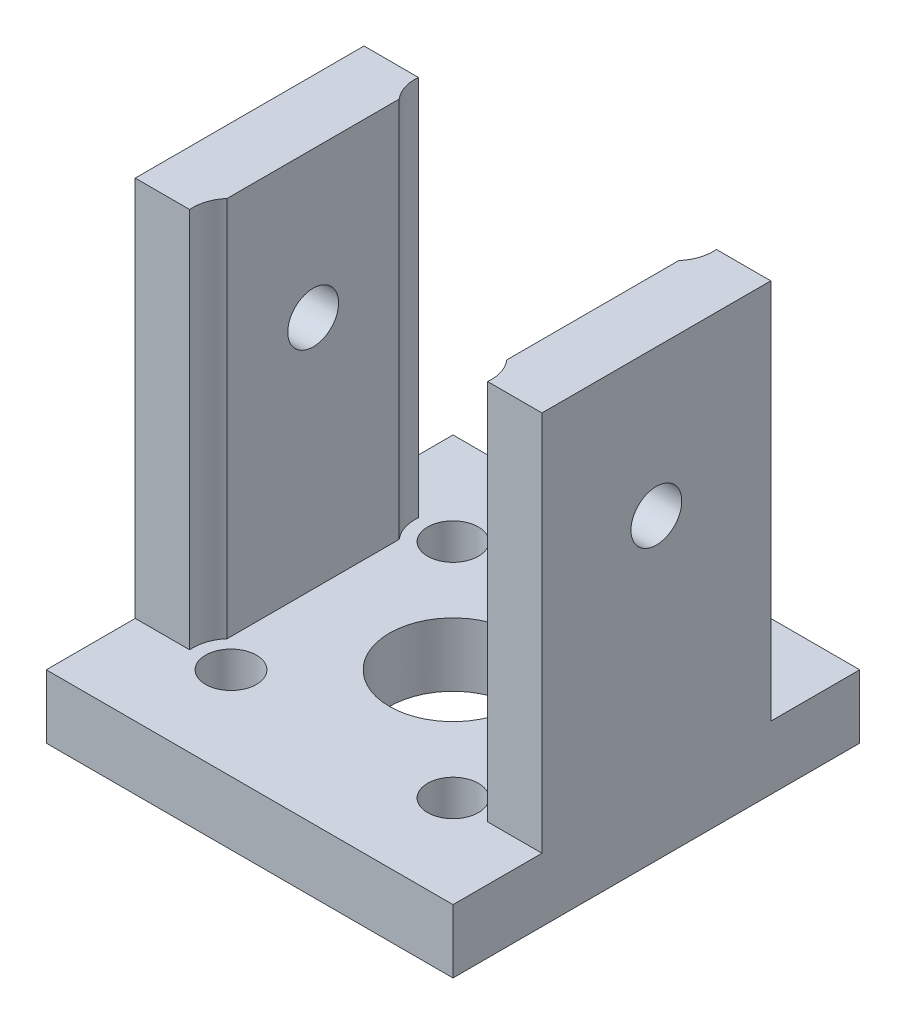
ISO-10303-21;
HEADER;
FILE_DESCRIPTION(('STEP AP214'),'2;1');
FILE_NAME('part.step','',(''),(''),'','','');
FILE_SCHEMA(('AUTOMOTIVE_DESIGN { 1 0 10303 214 1 1 1 1 }'));
ENDSEC;
DATA;
#1=APPLICATION_CONTEXT('core data for automotive mechanical design processes');
#2=APPLICATION_PROTOCOL_DEFINITION('international standard','automotive_design',2000,#1);
#3=PRODUCT_CONTEXT('',#1,'mechanical');
#4=PRODUCT('Part','Part','',(#3));
#5=PRODUCT_RELATED_PRODUCT_CATEGORY('part','',(#4));
#6=PRODUCT_DEFINITION_FORMATION('','',#4);
#7=PRODUCT_DEFINITION_CONTEXT('part definition',#1,'design');
#8=PRODUCT_DEFINITION('design','',#6,#7);
#9=PRODUCT_DEFINITION_SHAPE('','',#8);
#10=(LENGTH_UNIT() NAMED_UNIT(*) SI_UNIT(.MILLI.,.METRE.));
#11=(NAMED_UNIT(*) PLANE_ANGLE_UNIT() SI_UNIT($,.RADIAN.));
#12=(NAMED_UNIT(*) SI_UNIT($,.STERADIAN.) SOLID_ANGLE_UNIT());
#13=UNCERTAINTY_MEASURE_WITH_UNIT(LENGTH_MEASURE(1.E-05),#10,'distance_accuracy_value','');
#14=(GEOMETRIC_REPRESENTATION_CONTEXT(3) GLOBAL_UNCERTAINTY_ASSIGNED_CONTEXT((#13)) GLOBAL_UNIT_ASSIGNED_CONTEXT((#10,
#11,#12)) REPRESENTATION_CONTEXT('',''));
#15=CARTESIAN_POINT('',(0.,0.,0.));
#16=DIRECTION('',(0.,0.,1.));
#17=DIRECTION('',(1.,0.,0.));
#18=AXIS2_PLACEMENT_3D('',#15,#16,#17);
#19=CARTESIAN_POINT('',(0.,5.,0.));
#20=DIRECTION('',(0.,1.,0.));
#21=DIRECTION('',(0.,0.,1.));
#22=AXIS2_PLACEMENT_3D('',#19,#20,#21);
#23=PLANE('',#22);
#24=CARTESIAN_POINT('',(8.73276874765368,5.,7.26723125234616));
#25=DIRECTION('',(0.,1.,0.));
#26=DIRECTION('',(0.,0.,1.));
#27=AXIS2_PLACEMENT_3D('',#24,#25,#26);
#28=CIRCLE('',#27,2.00000000000035);
#29=CARTESIAN_POINT('',(8.73276874765368,5.,9.26723125234651));
#30=VERTEX_POINT('',#29);
#31=EDGE_CURVE('E564',#30,#30,#28,.T.);
#32=ORIENTED_EDGE('',*,*,#31,.F.);
#33=EDGE_LOOP('',(#32));
#34=FACE_BOUND('',#33,.T.);
#35=CARTESIAN_POINT('',(8.73276874765391,5.,24.7327687476539));
#36=DIRECTION('',(0.,1.,0.));
#37=DIRECTION('',(0.,0.,1.));
#38=AXIS2_PLACEMENT_3D('',#35,#36,#37);
#39=CIRCLE('',#38,2.);
#40=CARTESIAN_POINT('',(8.73276874765391,5.,26.7327687476539));
#41=VERTEX_POINT('',#40);
#42=EDGE_CURVE('E561',#41,#41,#39,.T.);
#43=ORIENTED_EDGE('',*,*,#42,.F.);
#44=EDGE_LOOP('',(#43));
#45=FACE_BOUND('',#44,.T.);
#46=CARTESIAN_POINT('',(-8.73276874765385,5.,24.7327687476538));
#47=DIRECTION('',(0.,1.,0.));
#48=DIRECTION('',(0.,0.,1.));
#49=AXIS2_PLACEMENT_3D('',#46,#47,#48);
#50=CIRCLE('',#49,2.);
#51=CARTESIAN_POINT('',(-8.73276874765385,5.,26.7327687476538));
#52=VERTEX_POINT('',#51);
#53=EDGE_CURVE('E558',#52,#52,#50,.T.);
#54=ORIENTED_EDGE('',*,*,#53,.F.);
#55=EDGE_LOOP('',(#54));
#56=FACE_BOUND('',#55,.T.);
#57=CARTESIAN_POINT('',(-8.73276874765404,5.,7.26723125234639));
#58=DIRECTION('',(0.,1.,0.));
#59=DIRECTION('',(0.,0.,1.));
#60=AXIS2_PLACEMENT_3D('',#57,#58,#59);
#61=CIRCLE('',#60,2.00000000000041);
#62=CARTESIAN_POINT('',(-8.73276874765404,5.,9.2672312523468));
#63=VERTEX_POINT('',#62);
#64=EDGE_CURVE('E555',#63,#63,#61,.T.);
#65=ORIENTED_EDGE('',*,*,#64,.F.);
#66=EDGE_LOOP('',(#65));
#67=FACE_BOUND('',#66,.T.);
#68=CARTESIAN_POINT('',(0.,5.,16.));
#69=DIRECTION('',(0.,1.,0.));
#70=DIRECTION('',(0.,0.,1.));
#71=AXIS2_PLACEMENT_3D('',#68,#69,#70);
#72=CIRCLE('',#71,5.);
#73=CARTESIAN_POINT('',(0.,5.,21.));
#74=VERTEX_POINT('',#73);
#75=EDGE_CURVE('E552',#74,#74,#72,.T.);
#76=ORIENTED_EDGE('',*,*,#75,.F.);
#77=EDGE_LOOP('',(#76));
#78=FACE_BOUND('',#77,.T.);
#79=DIRECTION('',(0.,0.,-1.));
#80=VECTOR('',#79,1.);
#81=CARTESIAN_POINT('',(16.,5.,0.));
#82=LINE('',#81,#80);
#83=CARTESIAN_POINT('',(16.,5.,32.));
#84=VERTEX_POINT('',#83);
#85=CARTESIAN_POINT('',(16.,5.,25.));
#86=VERTEX_POINT('',#85);
#87=EDGE_CURVE('E229',#84,#86,#82,.T.);
#88=ORIENTED_EDGE('',*,*,#87,.T.);
#89=DIRECTION('',(1.,0.,0.));
#90=VECTOR('',#89,1.);
#91=CARTESIAN_POINT('',(16.,5.,25.));
#92=LINE('',#91,#90);
#93=CARTESIAN_POINT('',(11.7257011928435,5.,25.));
#94=VERTEX_POINT('',#93);
#95=EDGE_CURVE('E579',#94,#86,#92,.T.);
#96=ORIENTED_EDGE('',*,*,#95,.F.);
#97=CARTESIAN_POINT('',(8.73723125234614,5.,24.7372312523464));
#98=DIRECTION('',(0.,-1.,0.));
#99=DIRECTION('',(0.,0.,1.));
#100=AXIS2_PLACEMENT_3D('',#97,#98,#99);
#101=CIRCLE('',#100,3.);
#102=CARTESIAN_POINT('',(11.,5.,22.7674907631852));
#103=VERTEX_POINT('',#102);
#104=EDGE_CURVE('E577',#103,#94,#101,.T.);
#105=ORIENTED_EDGE('',*,*,#104,.F.);
#106=DIRECTION('',(0.,0.,1.));
#107=VECTOR('',#106,1.);
#108=CARTESIAN_POINT('',(11.,5.,9.23697174150738));
#109=LINE('',#108,#107);
#110=CARTESIAN_POINT('',(11.,5.,9.23697174150738));
#111=VERTEX_POINT('',#110);
#112=EDGE_CURVE('E575',#111,#103,#109,.T.);
#113=ORIENTED_EDGE('',*,*,#112,.F.);
#114=CARTESIAN_POINT('',(8.73723125234596,5.,7.26723125234639));
#115=DIRECTION('',(0.,-1.,0.));
#116=DIRECTION('',(0.,0.,1.));
#117=AXIS2_PLACEMENT_3D('',#114,#115,#116);
#118=CIRCLE('',#117,3.);
#119=CARTESIAN_POINT('',(11.7253054578786,5.,7.));
#120=VERTEX_POINT('',#119);
#121=EDGE_CURVE('E172',#120,#111,#118,.T.);
#122=ORIENTED_EDGE('',*,*,#121,.F.);
#123=DIRECTION('',(-1.,0.,0.));
#124=VECTOR('',#123,1.);
#125=CARTESIAN_POINT('',(16.,5.,7.));
#126=LINE('',#125,#124);
#127=CARTESIAN_POINT('',(16.,5.,7.));
#128=VERTEX_POINT('',#127);
#129=EDGE_CURVE('E168',#128,#120,#126,.T.);
#130=ORIENTED_EDGE('',*,*,#129,.F.);
#131=CARTESIAN_POINT('',(16.,5.,0.));
#132=VERTEX_POINT('',#131);
#133=EDGE_CURVE('E228',#128,#132,#82,.T.);
#134=ORIENTED_EDGE('',*,*,#133,.T.);
#135=DIRECTION('',(-1.,0.,0.));
#136=VECTOR('',#135,1.);
#137=CARTESIAN_POINT('',(-16.,5.,0.));
#138=LINE('',#137,#136);
#139=CARTESIAN_POINT('',(-16.,5.,0.));
#140=VERTEX_POINT('',#139);
#141=EDGE_CURVE('E232',#132,#140,#138,.T.);
#142=ORIENTED_EDGE('',*,*,#141,.T.);
#143=DIRECTION('',(0.,0.,1.));
#144=VECTOR('',#143,1.);
#145=CARTESIAN_POINT('',(-16.,5.,0.));
#146=LINE('',#145,#144);
#147=CARTESIAN_POINT('',(-16.,5.,7.));
#148=VERTEX_POINT('',#147);
#149=EDGE_CURVE('E223',#140,#148,#146,.T.);
#150=ORIENTED_EDGE('',*,*,#149,.T.);
#151=DIRECTION('',(-1.,0.,0.));
#152=VECTOR('',#151,1.);
#153=CARTESIAN_POINT('',(-16.,5.,7.));
#154=LINE('',#153,#152);
#155=CARTESIAN_POINT('',(-11.7208429531867,5.,7.));
#156=VERTEX_POINT('',#155);
#157=EDGE_CURVE('E59',#156,#148,#154,.T.);
#158=ORIENTED_EDGE('',*,*,#157,.F.);
#159=CARTESIAN_POINT('',(-8.73276874765404,5.,7.26723125234639));
#160=DIRECTION('',(0.,-1.,0.));
#161=DIRECTION('',(0.,0.,1.));
#162=AXIS2_PLACEMENT_3D('',#159,#160,#161);
#163=CIRCLE('',#162,3.);
#164=CARTESIAN_POINT('',(-11.,5.,9.23183361628312));
#165=VERTEX_POINT('',#164);
#166=EDGE_CURVE('E202',#165,#156,#163,.T.);
#167=ORIENTED_EDGE('',*,*,#166,.F.);
#168=DIRECTION('',(0.,0.,-1.));
#169=VECTOR('',#168,1.);
#170=CARTESIAN_POINT('',(-11.,5.,9.23183361628312));
#171=LINE('',#170,#169);
#172=CARTESIAN_POINT('',(-11.,5.,22.7726288884099));
#173=VERTEX_POINT('',#172);
#174=EDGE_CURVE('E199',#173,#165,#171,.T.);
#175=ORIENTED_EDGE('',*,*,#174,.F.);
#176=CARTESIAN_POINT('',(-8.73276874765386,5.,24.7372312523464));
#177=DIRECTION('',(0.,-1.,0.));
#178=DIRECTION('',(0.,0.,1.));
#179=AXIS2_PLACEMENT_3D('',#176,#177,#178);
#180=CIRCLE('',#179,3.);
#181=CARTESIAN_POINT('',(-11.7212386881513,5.,25.));
#182=VERTEX_POINT('',#181);
#183=EDGE_CURVE('E177',#182,#173,#180,.T.);
#184=ORIENTED_EDGE('',*,*,#183,.F.);
#185=DIRECTION('',(1.,0.,0.));
#186=VECTOR('',#185,1.);
#187=CARTESIAN_POINT('',(-16.,5.,25.));
#188=LINE('',#187,#186);
#189=CARTESIAN_POINT('',(-16.,5.,25.));
#190=VERTEX_POINT('',#189);
#191=EDGE_CURVE('E174',#190,#182,#188,.T.);
#192=ORIENTED_EDGE('',*,*,#191,.F.);
#193=CARTESIAN_POINT('',(-16.,5.,32.));
#194=VERTEX_POINT('',#193);
#195=EDGE_CURVE('E226',#190,#194,#146,.T.);
#196=ORIENTED_EDGE('',*,*,#195,.T.);
#197=DIRECTION('',(1.,0.,0.));
#198=VECTOR('',#197,1.);
#199=CARTESIAN_POINT('',(-16.,5.,32.));
#200=LINE('',#199,#198);
#201=EDGE_CURVE('E225',#194,#84,#200,.T.);
#202=ORIENTED_EDGE('',*,*,#201,.T.);
#203=EDGE_LOOP('',(#88,#96,#105,#113,#122,#130,#134,#142,#150,#158,#167,#175,#184,#192,#196,#202));
#204=FACE_BOUND('',#203,.T.);
#205=ADVANCED_FACE('F35',(#34,#45,#56,#67,#78,#204),#23,.T.);
#206=CARTESIAN_POINT('',(-16.,5.,0.));
#207=DIRECTION('',(1.,0.,0.));
#208=DIRECTION('',(0.,0.,-1.));
#209=AXIS2_PLACEMENT_3D('',#206,#207,#208);
#210=PLANE('',#209);
#211=CARTESIAN_POINT('',(-16.,23.5000000000032,16.));
#212=DIRECTION('',(-1.,0.,0.));
#213=DIRECTION('',(0.,0.,1.));
#214=AXIS2_PLACEMENT_3D('',#211,#212,#213);
#215=CIRCLE('',#214,2.);
#216=CARTESIAN_POINT('',(-16.,23.5000000000032,18.));
#217=VERTEX_POINT('',#216);
#218=EDGE_CURVE('E527',#217,#217,#215,.T.);
#219=ORIENTED_EDGE('',*,*,#218,.F.);
#220=EDGE_LOOP('',(#219));
#221=FACE_BOUND('',#220,.T.);
#222=DIRECTION('',(0.,0.,1.));
#223=VECTOR('',#222,1.);
#224=CARTESIAN_POINT('',(-16.,0.,0.));
#225=LINE('',#224,#223);
#226=CARTESIAN_POINT('',(-16.,0.,0.));
#227=VERTEX_POINT('',#226);
#228=CARTESIAN_POINT('',(-16.,0.,32.));
#229=VERTEX_POINT('',#228);
#230=EDGE_CURVE('E222',#227,#229,#225,.T.);
#231=ORIENTED_EDGE('',*,*,#230,.T.);
#232=DIRECTION('',(0.,-1.,0.));
#233=VECTOR('',#232,1.);
#234=CARTESIAN_POINT('',(-16.,5.,32.));
#235=LINE('',#234,#233);
#236=EDGE_CURVE('E11',#194,#229,#235,.T.);
#237=ORIENTED_EDGE('',*,*,#236,.F.);
#238=ORIENTED_EDGE('',*,*,#195,.F.);
#239=DIRECTION('',(0.,-1.,0.));
#240=VECTOR('',#239,1.);
#241=CARTESIAN_POINT('',(-16.,35.,25.));
#242=LINE('',#241,#240);
#243=CARTESIAN_POINT('',(-16.,35.,25.));
#244=VERTEX_POINT('',#243);
#245=EDGE_CURVE('E219',#244,#190,#242,.T.);
#246=ORIENTED_EDGE('',*,*,#245,.F.);
#247=DIRECTION('',(0.,0.,1.));
#248=VECTOR('',#247,1.);
#249=CARTESIAN_POINT('',(-16.,35.,7.));
#250=LINE('',#249,#248);
#251=CARTESIAN_POINT('',(-16.,35.,7.));
#252=VERTEX_POINT('',#251);
#253=EDGE_CURVE('E183',#252,#244,#250,.T.);
#254=ORIENTED_EDGE('',*,*,#253,.F.);
#255=DIRECTION('',(0.,-1.,0.));
#256=VECTOR('',#255,1.);
#257=CARTESIAN_POINT('',(-16.,35.,7.));
#258=LINE('',#257,#256);
#259=EDGE_CURVE('E195',#252,#148,#258,.T.);
#260=ORIENTED_EDGE('',*,*,#259,.T.);
#261=ORIENTED_EDGE('',*,*,#149,.F.);
#262=DIRECTION('',(0.,-1.,0.));
#263=VECTOR('',#262,1.);
#264=CARTESIAN_POINT('',(-16.,5.,0.));
#265=LINE('',#264,#263);
#266=EDGE_CURVE('E234',#140,#227,#265,.T.);
#267=ORIENTED_EDGE('',*,*,#266,.T.);
#268=EDGE_LOOP('',(#231,#237,#238,#246,#254,#260,#261,#267));
#269=FACE_BOUND('',#268,.T.);
#270=ADVANCED_FACE('F37',(#221,#269),#210,.F.);
#271=CARTESIAN_POINT('',(-16.,5.,32.));
#272=DIRECTION('',(0.,0.,-1.));
#273=DIRECTION('',(-1.,0.,0.));
#274=AXIS2_PLACEMENT_3D('',#271,#272,#273);
#275=PLANE('',#274);
#276=DIRECTION('',(1.,0.,0.));
#277=VECTOR('',#276,1.);
#278=CARTESIAN_POINT('',(-16.,0.,32.));
#279=LINE('',#278,#277);
#280=CARTESIAN_POINT('',(16.,0.,32.));
#281=VERTEX_POINT('',#280);
#282=EDGE_CURVE('E237',#229,#281,#279,.T.);
#283=ORIENTED_EDGE('',*,*,#282,.T.);
#284=DIRECTION('',(0.,-1.,0.));
#285=VECTOR('',#284,1.);
#286=CARTESIAN_POINT('',(16.,5.,32.));
#287=LINE('',#286,#285);
#288=EDGE_CURVE('E44',#84,#281,#287,.T.);
#289=ORIENTED_EDGE('',*,*,#288,.F.);
#290=ORIENTED_EDGE('',*,*,#201,.F.);
#291=ORIENTED_EDGE('',*,*,#236,.T.);
#292=EDGE_LOOP('',(#283,#289,#290,#291));
#293=FACE_BOUND('',#292,.T.);
#294=ADVANCED_FACE('F291',(#293),#275,.F.);
#295=CARTESIAN_POINT('',(16.,5.,0.));
#296=DIRECTION('',(-1.,0.,0.));
#297=DIRECTION('',(0.,0.,1.));
#298=AXIS2_PLACEMENT_3D('',#295,#296,#297);
#299=PLANE('',#298);
#300=CARTESIAN_POINT('',(16.,23.5000000000032,16.));
#301=DIRECTION('',(-1.,0.,0.));
#302=DIRECTION('',(0.,0.,1.));
#303=AXIS2_PLACEMENT_3D('',#300,#301,#302);
#304=CIRCLE('',#303,2.);
#305=CARTESIAN_POINT('',(16.,23.5000000000032,18.));
#306=VERTEX_POINT('',#305);
#307=EDGE_CURVE('E537',#306,#306,#304,.T.);
#308=ORIENTED_EDGE('',*,*,#307,.T.);
#309=EDGE_LOOP('',(#308));
#310=FACE_BOUND('',#309,.T.);
#311=DIRECTION('',(0.,0.,-1.));
#312=VECTOR('',#311,1.);
#313=CARTESIAN_POINT('',(16.,0.,0.));
#314=LINE('',#313,#312);
#315=CARTESIAN_POINT('',(16.,0.,0.));
#316=VERTEX_POINT('',#315);
#317=EDGE_CURVE('E239',#281,#316,#314,.T.);
#318=ORIENTED_EDGE('',*,*,#317,.T.);
#319=DIRECTION('',(0.,-1.,0.));
#320=VECTOR('',#319,1.);
#321=CARTESIAN_POINT('',(16.,5.,0.));
#322=LINE('',#321,#320);
#323=EDGE_CURVE('E245',#132,#316,#322,.T.);
#324=ORIENTED_EDGE('',*,*,#323,.F.);
#325=ORIENTED_EDGE('',*,*,#133,.F.);
#326=DIRECTION('',(0.,-1.,0.));
#327=VECTOR('',#326,1.);
#328=CARTESIAN_POINT('',(16.,35.,7.));
#329=LINE('',#328,#327);
#330=CARTESIAN_POINT('',(16.,35.,7.));
#331=VERTEX_POINT('',#330);
#332=EDGE_CURVE('E51',#331,#128,#329,.T.);
#333=ORIENTED_EDGE('',*,*,#332,.F.);
#334=DIRECTION('',(0.,0.,-1.));
#335=VECTOR('',#334,1.);
#336=CARTESIAN_POINT('',(16.,35.,7.));
#337=LINE('',#336,#335);
#338=CARTESIAN_POINT('',(16.,35.,25.));
#339=VERTEX_POINT('',#338);
#340=EDGE_CURVE('E570',#339,#331,#337,.T.);
#341=ORIENTED_EDGE('',*,*,#340,.F.);
#342=DIRECTION('',(0.,-1.,0.));
#343=VECTOR('',#342,1.);
#344=CARTESIAN_POINT('',(16.,35.,25.));
#345=LINE('',#344,#343);
#346=EDGE_CURVE('E584',#339,#86,#345,.T.);
#347=ORIENTED_EDGE('',*,*,#346,.T.);
#348=ORIENTED_EDGE('',*,*,#87,.F.);
#349=ORIENTED_EDGE('',*,*,#288,.T.);
#350=EDGE_LOOP('',(#318,#324,#325,#333,#341,#347,#348,#349));
#351=FACE_BOUND('',#350,.T.);
#352=ADVANCED_FACE('F253',(#310,#351),#299,.F.);
#353=CARTESIAN_POINT('',(-16.,5.,0.));
#354=DIRECTION('',(0.,0.,1.));
#355=DIRECTION('',(1.,0.,0.));
#356=AXIS2_PLACEMENT_3D('',#353,#354,#355);
#357=PLANE('',#356);
#358=DIRECTION('',(-1.,0.,0.));
#359=VECTOR('',#358,1.);
#360=CARTESIAN_POINT('',(-16.,0.,0.));
#361=LINE('',#360,#359);
#362=EDGE_CURVE('E241',#316,#227,#361,.T.);
#363=ORIENTED_EDGE('',*,*,#362,.T.);
#364=ORIENTED_EDGE('',*,*,#266,.F.);
#365=ORIENTED_EDGE('',*,*,#141,.F.);
#366=ORIENTED_EDGE('',*,*,#323,.T.);
#367=EDGE_LOOP('',(#363,#364,#365,#366));
#368=FACE_BOUND('',#367,.T.);
#369=ADVANCED_FACE('F264',(#368),#357,.F.);
#370=CARTESIAN_POINT('',(0.,0.,0.));
#371=DIRECTION('',(0.,1.,0.));
#372=DIRECTION('',(0.,0.,1.));
#373=AXIS2_PLACEMENT_3D('',#370,#371,#372);
#374=PLANE('',#373);
#375=CARTESIAN_POINT('',(8.73276874765368,0.,7.26723125234616));
#376=DIRECTION('',(0.,-1.,0.));
#377=DIRECTION('',(0.,0.,-1.));
#378=AXIS2_PLACEMENT_3D('',#375,#376,#377);
#379=CIRCLE('',#378,2.00000000000035);
#380=CARTESIAN_POINT('',(8.73276874765368,0.,5.26723125234582));
#381=VERTEX_POINT('',#380);
#382=EDGE_CURVE('E531',#381,#381,#379,.T.);
#383=ORIENTED_EDGE('',*,*,#382,.F.);
#384=EDGE_LOOP('',(#383));
#385=FACE_BOUND('',#384,.T.);
#386=CARTESIAN_POINT('',(8.73276874765391,0.,24.7327687476539));
#387=DIRECTION('',(0.,-1.,0.));
#388=DIRECTION('',(0.,0.,-1.));
#389=AXIS2_PLACEMENT_3D('',#386,#387,#388);
#390=CIRCLE('',#389,2.);
#391=CARTESIAN_POINT('',(8.73276874765391,0.,22.7327687476539));
#392=VERTEX_POINT('',#391);
#393=EDGE_CURVE('E534',#392,#392,#390,.T.);
#394=ORIENTED_EDGE('',*,*,#393,.F.);
#395=EDGE_LOOP('',(#394));
#396=FACE_BOUND('',#395,.T.);
#397=CARTESIAN_POINT('',(-8.73276874765385,0.,24.7327687476538));
#398=DIRECTION('',(0.,-1.,0.));
#399=DIRECTION('',(0.,0.,-1.));
#400=AXIS2_PLACEMENT_3D('',#397,#398,#399);
#401=CIRCLE('',#400,2.);
#402=CARTESIAN_POINT('',(-8.73276874765385,0.,22.7327687476538));
#403=VERTEX_POINT('',#402);
#404=EDGE_CURVE('E545',#403,#403,#401,.T.);
#405=ORIENTED_EDGE('',*,*,#404,.F.);
#406=EDGE_LOOP('',(#405));
#407=FACE_BOUND('',#406,.T.);
#408=CARTESIAN_POINT('',(-8.73276874765404,0.,7.26723125234639));
#409=DIRECTION('',(0.,-1.,0.));
#410=DIRECTION('',(0.,0.,-1.));
#411=AXIS2_PLACEMENT_3D('',#408,#409,#410);
#412=CIRCLE('',#411,2.00000000000041);
#413=CARTESIAN_POINT('',(-8.73276874765404,0.,5.26723125234597));
#414=VERTEX_POINT('',#413);
#415=EDGE_CURVE('E541',#414,#414,#412,.T.);
#416=ORIENTED_EDGE('',*,*,#415,.F.);
#417=EDGE_LOOP('',(#416));
#418=FACE_BOUND('',#417,.T.);
#419=CARTESIAN_POINT('',(0.,0.,16.));
#420=DIRECTION('',(0.,-1.,0.));
#421=DIRECTION('',(0.,0.,-1.));
#422=AXIS2_PLACEMENT_3D('',#419,#420,#421);
#423=CIRCLE('',#422,5.);
#424=CARTESIAN_POINT('',(0.,0.,11.));
#425=VERTEX_POINT('',#424);
#426=EDGE_CURVE('E544',#425,#425,#423,.T.);
#427=ORIENTED_EDGE('',*,*,#426,.F.);
#428=EDGE_LOOP('',(#427));
#429=FACE_BOUND('',#428,.T.);
#430=ORIENTED_EDGE('',*,*,#230,.F.);
#431=ORIENTED_EDGE('',*,*,#362,.F.);
#432=ORIENTED_EDGE('',*,*,#317,.F.);
#433=ORIENTED_EDGE('',*,*,#282,.F.);
#434=EDGE_LOOP('',(#430,#431,#432,#433));
#435=FACE_BOUND('',#434,.T.);
#436=ADVANCED_FACE('F261',(#385,#396,#407,#418,#429,#435),#374,.F.);
#437=CARTESIAN_POINT('',(-16.,35.,25.));
#438=DIRECTION('',(0.,0.,-1.));
#439=DIRECTION('',(-1.,0.,0.));
#440=AXIS2_PLACEMENT_3D('',#437,#438,#439);
#441=PLANE('',#440);
#442=ORIENTED_EDGE('',*,*,#191,.T.);
#443=DIRECTION('',(0.,-1.,0.));
#444=VECTOR('',#443,1.);
#445=CARTESIAN_POINT('',(-11.7212386881513,35.,25.));
#446=LINE('',#445,#444);
#447=CARTESIAN_POINT('',(-11.7212386881513,35.,25.));
#448=VERTEX_POINT('',#447);
#449=EDGE_CURVE('E216',#448,#182,#446,.T.);
#450=ORIENTED_EDGE('',*,*,#449,.F.);
#451=DIRECTION('',(1.,0.,0.));
#452=VECTOR('',#451,1.);
#453=CARTESIAN_POINT('',(-16.,35.,25.));
#454=LINE('',#453,#452);
#455=EDGE_CURVE('E186',#244,#448,#454,.T.);
#456=ORIENTED_EDGE('',*,*,#455,.F.);
#457=ORIENTED_EDGE('',*,*,#245,.T.);
#458=EDGE_LOOP('',(#442,#450,#456,#457));
#459=FACE_BOUND('',#458,.T.);
#460=ADVANCED_FACE('F289',(#459),#441,.F.);
#461=CARTESIAN_POINT('',(-8.73276874765386,35.,24.7372312523464));
#462=DIRECTION('',(0.,-1.,0.));
#463=DIRECTION('',(0.,0.,-1.));
#464=AXIS2_PLACEMENT_3D('',#461,#462,#463);
#465=CYLINDRICAL_SURFACE('',#464,3.);
#466=ORIENTED_EDGE('',*,*,#183,.T.);
#467=DIRECTION('',(0.,-1.,0.));
#468=VECTOR('',#467,1.);
#469=CARTESIAN_POINT('',(-11.,35.,22.7726288884099));
#470=LINE('',#469,#468);
#471=CARTESIAN_POINT('',(-11.,35.,22.7726288884099));
#472=VERTEX_POINT('',#471);
#473=EDGE_CURVE('E213',#472,#173,#470,.T.);
#474=ORIENTED_EDGE('',*,*,#473,.F.);
#475=CARTESIAN_POINT('',(-8.73276874765386,35.,24.7372312523464));
#476=DIRECTION('',(0.,-1.,0.));
#477=DIRECTION('',(0.,0.,1.));
#478=AXIS2_PLACEMENT_3D('',#475,#476,#477);
#479=CIRCLE('',#478,3.);
#480=EDGE_CURVE('E188',#448,#472,#479,.T.);
#481=ORIENTED_EDGE('',*,*,#480,.F.);
#482=ORIENTED_EDGE('',*,*,#449,.T.);
#483=EDGE_LOOP('',(#466,#474,#481,#482));
#484=FACE_BOUND('',#483,.T.);
#485=ADVANCED_FACE('F285',(#484),#465,.F.);
#486=CARTESIAN_POINT('',(-11.,35.,9.23183361628312));
#487=DIRECTION('',(-1.,0.,0.));
#488=DIRECTION('',(0.,0.,1.));
#489=AXIS2_PLACEMENT_3D('',#486,#487,#488);
#490=PLANE('',#489);
#491=CARTESIAN_POINT('',(-11.,23.5000000000032,16.));
#492=DIRECTION('',(-1.,0.,0.));
#493=DIRECTION('',(0.,0.,1.));
#494=AXIS2_PLACEMENT_3D('',#491,#492,#493);
#495=CIRCLE('',#494,2.);
#496=CARTESIAN_POINT('',(-11.,23.5000000000032,18.));
#497=VERTEX_POINT('',#496);
#498=EDGE_CURVE('E530',#497,#497,#495,.T.);
#499=ORIENTED_EDGE('',*,*,#498,.T.);
#500=EDGE_LOOP('',(#499));
#501=FACE_BOUND('',#500,.T.);
#502=ORIENTED_EDGE('',*,*,#174,.T.);
#503=DIRECTION('',(0.,-1.,0.));
#504=VECTOR('',#503,1.);
#505=CARTESIAN_POINT('',(-11.,35.,9.23183361628312));
#506=LINE('',#505,#504);
#507=CARTESIAN_POINT('',(-11.,35.,9.23183361628312));
#508=VERTEX_POINT('',#507);
#509=EDGE_CURVE('E210',#508,#165,#506,.T.);
#510=ORIENTED_EDGE('',*,*,#509,.F.);
#511=DIRECTION('',(0.,0.,-1.));
#512=VECTOR('',#511,1.);
#513=CARTESIAN_POINT('',(-11.,35.,9.23183361628312));
#514=LINE('',#513,#512);
#515=EDGE_CURVE('E190',#472,#508,#514,.T.);
#516=ORIENTED_EDGE('',*,*,#515,.F.);
#517=ORIENTED_EDGE('',*,*,#473,.T.);
#518=EDGE_LOOP('',(#502,#510,#516,#517));
#519=FACE_BOUND('',#518,.T.);
#520=ADVANCED_FACE('F280',(#501,#519),#490,.F.);
#521=CARTESIAN_POINT('',(-8.73276874765404,35.,7.26723125234639));
#522=DIRECTION('',(0.,-1.,0.));
#523=DIRECTION('',(0.,0.,-1.));
#524=AXIS2_PLACEMENT_3D('',#521,#522,#523);
#525=CYLINDRICAL_SURFACE('',#524,3.);
#526=ORIENTED_EDGE('',*,*,#166,.T.);
#527=DIRECTION('',(0.,-1.,0.));
#528=VECTOR('',#527,1.);
#529=CARTESIAN_POINT('',(-11.7208429531867,35.,7.));
#530=LINE('',#529,#528);
#531=CARTESIAN_POINT('',(-11.7208429531867,35.,7.));
#532=VERTEX_POINT('',#531);
#533=EDGE_CURVE('E207',#532,#156,#530,.T.);
#534=ORIENTED_EDGE('',*,*,#533,.F.);
#535=CARTESIAN_POINT('',(-8.73276874765404,35.,7.26723125234639));
#536=DIRECTION('',(0.,-1.,0.));
#537=DIRECTION('',(0.,0.,1.));
#538=AXIS2_PLACEMENT_3D('',#535,#536,#537);
#539=CIRCLE('',#538,3.);
#540=EDGE_CURVE('E192',#508,#532,#539,.T.);
#541=ORIENTED_EDGE('',*,*,#540,.F.);
#542=ORIENTED_EDGE('',*,*,#509,.T.);
#543=EDGE_LOOP('',(#526,#534,#541,#542));
#544=FACE_BOUND('',#543,.T.);
#545=ADVANCED_FACE('F277',(#544),#525,.F.);
#546=CARTESIAN_POINT('',(-16.,35.,7.));
#547=DIRECTION('',(0.,0.,1.));
#548=DIRECTION('',(1.,0.,0.));
#549=AXIS2_PLACEMENT_3D('',#546,#547,#548);
#550=PLANE('',#549);
#551=ORIENTED_EDGE('',*,*,#157,.T.);
#552=ORIENTED_EDGE('',*,*,#259,.F.);
#553=DIRECTION('',(-1.,0.,0.));
#554=VECTOR('',#553,1.);
#555=CARTESIAN_POINT('',(-16.,35.,7.));
#556=LINE('',#555,#554);
#557=EDGE_CURVE('E194',#532,#252,#556,.T.);
#558=ORIENTED_EDGE('',*,*,#557,.F.);
#559=ORIENTED_EDGE('',*,*,#533,.T.);
#560=EDGE_LOOP('',(#551,#552,#558,#559));
#561=FACE_BOUND('',#560,.T.);
#562=ADVANCED_FACE('F272',(#561),#550,.F.);
#563=CARTESIAN_POINT('',(-8.73276874765386,35.,24.7372312523464));
#564=DIRECTION('',(0.,1.,0.));
#565=DIRECTION('',(0.,0.,1.));
#566=AXIS2_PLACEMENT_3D('',#563,#564,#565);
#567=PLANE('',#566);
#568=ORIENTED_EDGE('',*,*,#253,.T.);
#569=ORIENTED_EDGE('',*,*,#455,.T.);
#570=ORIENTED_EDGE('',*,*,#480,.T.);
#571=ORIENTED_EDGE('',*,*,#515,.T.);
#572=ORIENTED_EDGE('',*,*,#540,.T.);
#573=ORIENTED_EDGE('',*,*,#557,.T.);
#574=EDGE_LOOP('',(#568,#569,#570,#571,#572,#573));
#575=FACE_BOUND('',#574,.T.);
#576=ADVANCED_FACE('F353',(#575),#567,.T.);
#577=CARTESIAN_POINT('',(8.73723125234596,35.,7.26723125234639));
#578=DIRECTION('',(0.,-1.,0.));
#579=DIRECTION('',(0.,0.,-1.));
#580=AXIS2_PLACEMENT_3D('',#577,#578,#579);
#581=CYLINDRICAL_SURFACE('',#580,3.);
#582=ORIENTED_EDGE('',*,*,#121,.T.);
#583=DIRECTION('',(0.,-1.,0.));
#584=VECTOR('',#583,1.);
#585=CARTESIAN_POINT('',(11.,35.,9.23697174150738));
#586=LINE('',#585,#584);
#587=CARTESIAN_POINT('',(11.,35.,9.23697174150738));
#588=VERTEX_POINT('',#587);
#589=EDGE_CURVE('E153',#588,#111,#586,.T.);
#590=ORIENTED_EDGE('',*,*,#589,.F.);
#591=CARTESIAN_POINT('',(8.73723125234596,35.,7.26723125234639));
#592=DIRECTION('',(0.,-1.,0.));
#593=DIRECTION('',(0.,0.,1.));
#594=AXIS2_PLACEMENT_3D('',#591,#592,#593);
#595=CIRCLE('',#594,3.);
#596=CARTESIAN_POINT('',(11.7253054578786,35.,7.));
#597=VERTEX_POINT('',#596);
#598=EDGE_CURVE('E160',#597,#588,#595,.T.);
#599=ORIENTED_EDGE('',*,*,#598,.F.);
#600=DIRECTION('',(0.,-1.,0.));
#601=VECTOR('',#600,1.);
#602=CARTESIAN_POINT('',(11.7253054578786,35.,7.));
#603=LINE('',#602,#601);
#604=EDGE_CURVE('E573',#597,#120,#603,.T.);
#605=ORIENTED_EDGE('',*,*,#604,.T.);
#606=EDGE_LOOP('',(#582,#590,#599,#605));
#607=FACE_BOUND('',#606,.T.);
#608=ADVANCED_FACE('F170',(#607),#581,.F.);
#609=CARTESIAN_POINT('',(11.,35.,9.23697174150738));
#610=DIRECTION('',(1.,0.,0.));
#611=DIRECTION('',(0.,0.,-1.));
#612=AXIS2_PLACEMENT_3D('',#609,#610,#611);
#613=PLANE('',#612);
#614=CARTESIAN_POINT('',(11.,23.5000000000032,16.));
#615=DIRECTION('',(1.,0.,0.));
#616=DIRECTION('',(0.,0.,-1.));
#617=AXIS2_PLACEMENT_3D('',#614,#615,#616);
#618=CIRCLE('',#617,2.);
#619=CARTESIAN_POINT('',(11.,23.5000000000032,14.));
#620=VERTEX_POINT('',#619);
#621=EDGE_CURVE('E39',#620,#620,#618,.T.);
#622=ORIENTED_EDGE('',*,*,#621,.T.);
#623=EDGE_LOOP('',(#622));
#624=FACE_BOUND('',#623,.T.);
#625=ORIENTED_EDGE('',*,*,#112,.T.);
#626=DIRECTION('',(0.,-1.,0.));
#627=VECTOR('',#626,1.);
#628=CARTESIAN_POINT('',(11.,35.,22.7674907631852));
#629=LINE('',#628,#627);
#630=CARTESIAN_POINT('',(11.,35.,22.7674907631852));
#631=VERTEX_POINT('',#630);
#632=EDGE_CURVE('E156',#631,#103,#629,.T.);
#633=ORIENTED_EDGE('',*,*,#632,.F.);
#634=DIRECTION('',(0.,0.,1.));
#635=VECTOR('',#634,1.);
#636=CARTESIAN_POINT('',(11.,35.,9.23697174150738));
#637=LINE('',#636,#635);
#638=EDGE_CURVE('E149',#588,#631,#637,.T.);
#639=ORIENTED_EDGE('',*,*,#638,.F.);
#640=ORIENTED_EDGE('',*,*,#589,.T.);
#641=EDGE_LOOP('',(#625,#633,#639,#640));
#642=FACE_BOUND('',#641,.T.);
#643=ADVANCED_FACE('F151',(#624,#642),#613,.F.);
#644=CARTESIAN_POINT('',(8.73723125234614,35.,24.7372312523464));
#645=DIRECTION('',(0.,-1.,0.));
#646=DIRECTION('',(0.,0.,-1.));
#647=AXIS2_PLACEMENT_3D('',#644,#645,#646);
#648=CYLINDRICAL_SURFACE('',#647,3.);
#649=ORIENTED_EDGE('',*,*,#104,.T.);
#650=DIRECTION('',(0.,-1.,0.));
#651=VECTOR('',#650,1.);
#652=CARTESIAN_POINT('',(11.7257011928435,35.,25.));
#653=LINE('',#652,#651);
#654=CARTESIAN_POINT('',(11.7257011928435,35.,25.));
#655=VERTEX_POINT('',#654);
#656=EDGE_CURVE('E179',#655,#94,#653,.T.);
#657=ORIENTED_EDGE('',*,*,#656,.F.);
#658=CARTESIAN_POINT('',(8.73723125234614,35.,24.7372312523464));
#659=DIRECTION('',(0.,-1.,0.));
#660=DIRECTION('',(0.,0.,1.));
#661=AXIS2_PLACEMENT_3D('',#658,#659,#660);
#662=CIRCLE('',#661,3.);
#663=EDGE_CURVE('E159',#631,#655,#662,.T.);
#664=ORIENTED_EDGE('',*,*,#663,.F.);
#665=ORIENTED_EDGE('',*,*,#632,.T.);
#666=EDGE_LOOP('',(#649,#657,#664,#665));
#667=FACE_BOUND('',#666,.T.);
#668=ADVANCED_FACE('F373',(#667),#648,.F.);
#669=CARTESIAN_POINT('',(16.,35.,25.));
#670=DIRECTION('',(0.,0.,-1.));
#671=DIRECTION('',(-1.,0.,0.));
#672=AXIS2_PLACEMENT_3D('',#669,#670,#671);
#673=PLANE('',#672);
#674=ORIENTED_EDGE('',*,*,#95,.T.);
#675=ORIENTED_EDGE('',*,*,#346,.F.);
#676=DIRECTION('',(1.,0.,0.));
#677=VECTOR('',#676,1.);
#678=CARTESIAN_POINT('',(16.,35.,25.));
#679=LINE('',#678,#677);
#680=EDGE_CURVE('E568',#655,#339,#679,.T.);
#681=ORIENTED_EDGE('',*,*,#680,.F.);
#682=ORIENTED_EDGE('',*,*,#656,.T.);
#683=EDGE_LOOP('',(#674,#675,#681,#682));
#684=FACE_BOUND('',#683,.T.);
#685=ADVANCED_FACE('F381',(#684),#673,.F.);
#686=CARTESIAN_POINT('',(16.,35.,7.));
#687=DIRECTION('',(0.,0.,1.));
#688=DIRECTION('',(1.,0.,0.));
#689=AXIS2_PLACEMENT_3D('',#686,#687,#688);
#690=PLANE('',#689);
#691=ORIENTED_EDGE('',*,*,#129,.T.);
#692=ORIENTED_EDGE('',*,*,#604,.F.);
#693=DIRECTION('',(-1.,0.,0.));
#694=VECTOR('',#693,1.);
#695=CARTESIAN_POINT('',(16.,35.,7.));
#696=LINE('',#695,#694);
#697=EDGE_CURVE('E164',#331,#597,#696,.T.);
#698=ORIENTED_EDGE('',*,*,#697,.F.);
#699=ORIENTED_EDGE('',*,*,#332,.T.);
#700=EDGE_LOOP('',(#691,#692,#698,#699));
#701=FACE_BOUND('',#700,.T.);
#702=ADVANCED_FACE('F389',(#701),#690,.F.);
#703=CARTESIAN_POINT('',(8.73723125234596,35.,7.26723125234639));
#704=DIRECTION('',(0.,1.,0.));
#705=DIRECTION('',(0.,0.,1.));
#706=AXIS2_PLACEMENT_3D('',#703,#704,#705);
#707=PLANE('',#706);
#708=ORIENTED_EDGE('',*,*,#598,.T.);
#709=ORIENTED_EDGE('',*,*,#638,.T.);
#710=ORIENTED_EDGE('',*,*,#663,.T.);
#711=ORIENTED_EDGE('',*,*,#680,.T.);
#712=ORIENTED_EDGE('',*,*,#340,.T.);
#713=ORIENTED_EDGE('',*,*,#697,.T.);
#714=EDGE_LOOP('',(#708,#709,#710,#711,#712,#713));
#715=FACE_BOUND('',#714,.T.);
#716=ADVANCED_FACE('F163',(#715),#707,.T.);
#717=CARTESIAN_POINT('',(0.,10.,16.));
#718=DIRECTION('',(0.,-1.,0.));
#719=DIRECTION('',(0.,0.,-1.));
#720=AXIS2_PLACEMENT_3D('',#717,#718,#719);
#721=CYLINDRICAL_SURFACE('',#720,5.);
#722=ORIENTED_EDGE('',*,*,#75,.T.);
#723=EDGE_LOOP('',(#722));
#724=FACE_BOUND('',#723,.T.);
#725=ORIENTED_EDGE('',*,*,#426,.T.);
#726=EDGE_LOOP('',(#725));
#727=FACE_BOUND('',#726,.T.);
#728=ADVANCED_FACE('F403',(#724,#727),#721,.F.);
#729=CARTESIAN_POINT('',(-8.73276874765404,10.,7.26723125234639));
#730=DIRECTION('',(0.,-1.,0.));
#731=DIRECTION('',(0.,0.,-1.));
#732=AXIS2_PLACEMENT_3D('',#729,#730,#731);
#733=CYLINDRICAL_SURFACE('',#732,2.00000000000041);
#734=ORIENTED_EDGE('',*,*,#64,.T.);
#735=EDGE_LOOP('',(#734));
#736=FACE_BOUND('',#735,.T.);
#737=ORIENTED_EDGE('',*,*,#415,.T.);
#738=EDGE_LOOP('',(#737));
#739=FACE_BOUND('',#738,.T.);
#740=ADVANCED_FACE('F409',(#736,#739),#733,.F.);
#741=CARTESIAN_POINT('',(-8.73276874765385,10.,24.7327687476538));
#742=DIRECTION('',(0.,-1.,0.));
#743=DIRECTION('',(0.,0.,-1.));
#744=AXIS2_PLACEMENT_3D('',#741,#742,#743);
#745=CYLINDRICAL_SURFACE('',#744,2.);
#746=ORIENTED_EDGE('',*,*,#53,.T.);
#747=EDGE_LOOP('',(#746));
#748=FACE_BOUND('',#747,.T.);
#749=ORIENTED_EDGE('',*,*,#404,.T.);
#750=EDGE_LOOP('',(#749));
#751=FACE_BOUND('',#750,.T.);
#752=ADVANCED_FACE('F417',(#748,#751),#745,.F.);
#753=CARTESIAN_POINT('',(8.73276874765391,10.,24.7327687476539));
#754=DIRECTION('',(0.,-1.,0.));
#755=DIRECTION('',(0.,0.,-1.));
#756=AXIS2_PLACEMENT_3D('',#753,#754,#755);
#757=CYLINDRICAL_SURFACE('',#756,2.);
#758=ORIENTED_EDGE('',*,*,#42,.T.);
#759=EDGE_LOOP('',(#758));
#760=FACE_BOUND('',#759,.T.);
#761=ORIENTED_EDGE('',*,*,#393,.T.);
#762=EDGE_LOOP('',(#761));
#763=FACE_BOUND('',#762,.T.);
#764=ADVANCED_FACE('F425',(#760,#763),#757,.F.);
#765=CARTESIAN_POINT('',(8.73276874765368,10.,7.26723125234616));
#766=DIRECTION('',(0.,-1.,0.));
#767=DIRECTION('',(0.,0.,-1.));
#768=AXIS2_PLACEMENT_3D('',#765,#766,#767);
#769=CYLINDRICAL_SURFACE('',#768,2.00000000000035);
#770=ORIENTED_EDGE('',*,*,#31,.T.);
#771=EDGE_LOOP('',(#770));
#772=FACE_BOUND('',#771,.T.);
#773=ORIENTED_EDGE('',*,*,#382,.T.);
#774=EDGE_LOOP('',(#773));
#775=FACE_BOUND('',#774,.T.);
#776=ADVANCED_FACE('F433',(#772,#775),#769,.F.);
#777=CARTESIAN_POINT('',(16.,23.5000000000032,16.));
#778=DIRECTION('',(-1.,0.,0.));
#779=DIRECTION('',(0.,0.,1.));
#780=AXIS2_PLACEMENT_3D('',#777,#778,#779);
#781=CYLINDRICAL_SURFACE('',#780,2.);
#782=ORIENTED_EDGE('',*,*,#307,.F.);
#783=EDGE_LOOP('',(#782));
#784=FACE_BOUND('',#783,.T.);
#785=ORIENTED_EDGE('',*,*,#621,.F.);
#786=EDGE_LOOP('',(#785));
#787=FACE_BOUND('',#786,.T.);
#788=ADVANCED_FACE('F441',(#784,#787),#781,.F.);
#789=ORIENTED_EDGE('',*,*,#218,.T.);
#790=EDGE_LOOP('',(#789));
#791=FACE_BOUND('',#790,.T.);
#792=ORIENTED_EDGE('',*,*,#498,.F.);
#793=EDGE_LOOP('',(#792));
#794=FACE_BOUND('',#793,.T.);
#795=ADVANCED_FACE('F449',(#791,#794),#781,.F.);
#796=CLOSED_SHELL('',(#205,#270,#294,#352,#369,#436,#460,#485,#520,#545,#562,#576,#608,#643,
#668,#685,#702,#716,#728,#740,#752,#764,#776,#788,#795));
#797=MANIFOLD_SOLID_BREP('B2',#796);
#798=ADVANCED_BREP_SHAPE_REPRESENTATION('',(#18,#797),#14);
#799=SHAPE_DEFINITION_REPRESENTATION(#9,#798);
ENDSEC;
END-ISO-10303-21;
